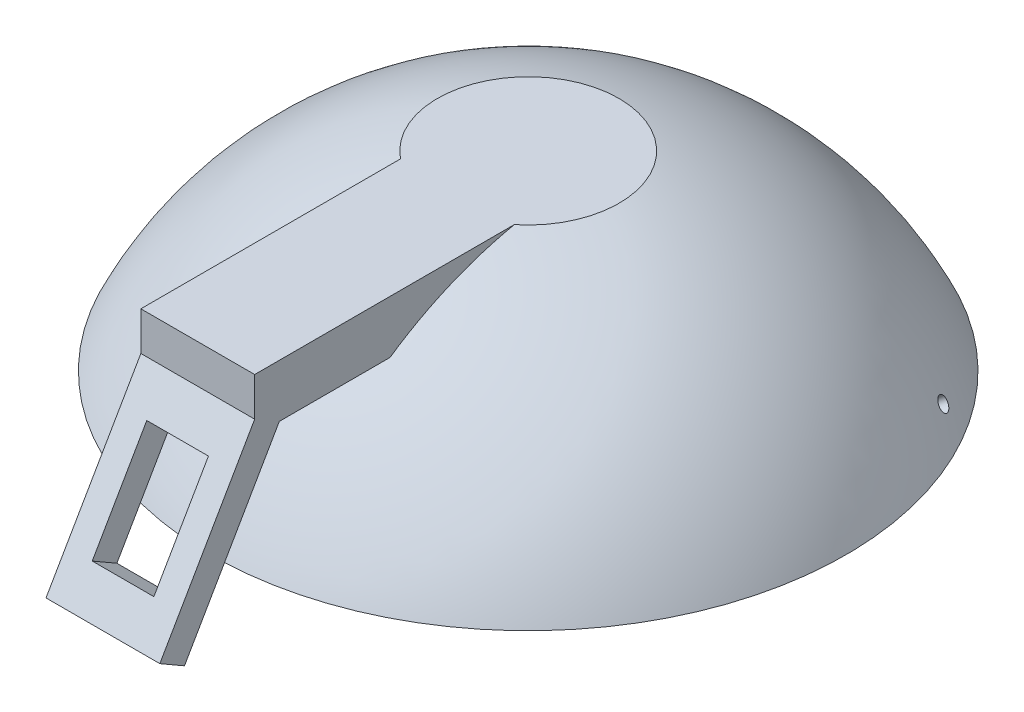
ISO-10303-21;
HEADER;
FILE_DESCRIPTION(('STEP AP214'),'2;1');
FILE_NAME('part.step','',(''),(''),'','','');
FILE_SCHEMA(('AUTOMOTIVE_DESIGN { 1 0 10303 214 1 1 1 1 }'));
ENDSEC;
DATA;
#1=APPLICATION_CONTEXT('core data for automotive mechanical design processes');
#2=APPLICATION_PROTOCOL_DEFINITION('international standard','automotive_design',2000,#1);
#3=PRODUCT_CONTEXT('',#1,'mechanical');
#4=PRODUCT('Part','Part','',(#3));
#5=PRODUCT_RELATED_PRODUCT_CATEGORY('part','',(#4));
#6=PRODUCT_DEFINITION_FORMATION('','',#4);
#7=PRODUCT_DEFINITION_CONTEXT('part definition',#1,'design');
#8=PRODUCT_DEFINITION('design','',#6,#7);
#9=PRODUCT_DEFINITION_SHAPE('','',#8);
#10=(LENGTH_UNIT() NAMED_UNIT(*) SI_UNIT(.MILLI.,.METRE.));
#11=(NAMED_UNIT(*) PLANE_ANGLE_UNIT() SI_UNIT($,.RADIAN.));
#12=(NAMED_UNIT(*) SI_UNIT($,.STERADIAN.) SOLID_ANGLE_UNIT());
#13=UNCERTAINTY_MEASURE_WITH_UNIT(LENGTH_MEASURE(1.E-05),#10,'distance_accuracy_value','');
#14=(GEOMETRIC_REPRESENTATION_CONTEXT(3) GLOBAL_UNCERTAINTY_ASSIGNED_CONTEXT((#13)) GLOBAL_UNIT_ASSIGNED_CONTEXT((#10,
#11,#12)) REPRESENTATION_CONTEXT('',''));
#15=CARTESIAN_POINT('',(0.,0.,0.));
#16=DIRECTION('',(0.,0.,1.));
#17=DIRECTION('',(1.,0.,0.));
#18=AXIS2_PLACEMENT_3D('',#15,#16,#17);
#19=CARTESIAN_POINT('',(0.,0.,0.));
#20=DIRECTION('',(0.,-1.,0.));
#21=DIRECTION('',(1.,0.,0.));
#22=AXIS2_PLACEMENT_3D('',#19,#20,#21);
#23=SPHERICAL_SURFACE('',#22,74.);
#24=CARTESIAN_POINT('',(55.4885968015053,36.9923978676701,-32.036356300303));
#25=DIRECTION('',(-0.750000000000003,-0.500000000000001,0.433012701892212));
#26=DIRECTION('',(0.554700196225228,-0.832050294337844,0.));
#27=AXIS2_PLACEMENT_3D('',#24,#25,#26);
#28=CIRCLE('',#27,1.5);
#29=CARTESIAN_POINT('',(56.3206470958432,35.7443224261634,-32.036356300303));
#30=VERTEX_POINT('',#29);
#31=EDGE_CURVE('E203',#30,#30,#28,.T.);
#32=ORIENTED_EDGE('',*,*,#31,.T.);
#33=EDGE_LOOP('',(#32));
#34=FACE_BOUND('',#33,.T.);
#35=CARTESIAN_POINT('',(0.,31.2737513688116,0.));
#36=DIRECTION('',(0.,-1.,0.));
#37=DIRECTION('',(0.,0.,-1.));
#38=AXIS2_PLACEMENT_3D('',#35,#36,#37);
#39=CIRCLE('',#38,67.0667762407122);
#40=CARTESIAN_POINT('',(0.,31.2737513688116,-67.0667762407122));
#41=VERTEX_POINT('',#40);
#42=EDGE_CURVE('E48',#41,#41,#39,.T.);
#43=ORIENTED_EDGE('',*,*,#42,.F.);
#44=EDGE_LOOP('',(#43));
#45=FACE_BOUND('',#44,.T.);
#46=CARTESIAN_POINT('',(0.,36.9923978676701,64.0727126006071));
#47=DIRECTION('',(0.,-0.500000000000001,-0.866025403784438));
#48=DIRECTION('',(0.,0.866025403784438,-0.500000000000001));
#49=AXIS2_PLACEMENT_3D('',#46,#47,#48);
#50=CIRCLE('',#49,1.5);
#51=CARTESIAN_POINT('',(0.,38.2914359733468,63.3227126006071));
#52=VERTEX_POINT('',#51);
#53=EDGE_CURVE('E222',#52,#52,#50,.T.);
#54=ORIENTED_EDGE('',*,*,#53,.T.);
#55=EDGE_LOOP('',(#54));
#56=FACE_BOUND('',#55,.T.);
#57=CARTESIAN_POINT('',(-55.4885968015049,36.9923978676701,-32.0363563003038));
#58=DIRECTION('',(0.749999999999998,-0.500000000000001,0.433012701892223));
#59=DIRECTION('',(0.554700196225231,0.832050294337842,0.));
#60=AXIS2_PLACEMENT_3D('',#57,#58,#59);
#61=CIRCLE('',#60,1.5);
#62=CARTESIAN_POINT('',(-54.656546507167,38.2404733091769,-32.0363563003038));
#63=VERTEX_POINT('',#62);
#64=EDGE_CURVE('E43',#63,#63,#61,.T.);
#65=ORIENTED_EDGE('',*,*,#64,.T.);
#66=EDGE_LOOP('',(#65));
#67=FACE_BOUND('',#66,.T.);
#68=CARTESIAN_POINT('',(0.,71.478511145391,0.));
#69=DIRECTION('',(0.,-1.,0.));
#70=DIRECTION('',(0.,0.,-1.));
#71=AXIS2_PLACEMENT_3D('',#68,#69,#70);
#72=CIRCLE('',#71,19.1526093375866);
#73=CARTESIAN_POINT('',(-12.,71.478511145391,14.9272383392981));
#74=VERTEX_POINT('',#73);
#75=CARTESIAN_POINT('',(12.,71.478511145391,14.927238339298));
#76=VERTEX_POINT('',#75);
#77=EDGE_CURVE('E129',#74,#76,#72,.T.);
#78=ORIENTED_EDGE('',*,*,#77,.T.);
#79=CARTESIAN_POINT('',(12.,0.,0.));
#80=DIRECTION('',(-1.,0.,0.));
#81=DIRECTION('',(0.,0.,1.));
#82=AXIS2_PLACEMENT_3D('',#79,#80,#81);
#83=CIRCLE('',#82,73.0205450541147);
#84=CARTESIAN_POINT('',(12.,60.3205080756888,41.151382789534));
#85=VERTEX_POINT('',#84);
#86=EDGE_CURVE('E56',#85,#76,#83,.T.);
#87=ORIENTED_EDGE('',*,*,#86,.F.);
#88=CARTESIAN_POINT('',(0.,60.3205080756888,0.));
#89=DIRECTION('',(0.,1.,0.));
#90=DIRECTION('',(0.,0.,1.));
#91=AXIS2_PLACEMENT_3D('',#88,#89,#90);
#92=CIRCLE('',#91,42.865327544424);
#93=CARTESIAN_POINT('',(-12.,60.3205080756888,41.151382789534));
#94=VERTEX_POINT('',#93);
#95=EDGE_CURVE('E60',#94,#85,#92,.T.);
#96=ORIENTED_EDGE('',*,*,#95,.F.);
#97=CARTESIAN_POINT('',(-12.,0.,0.));
#98=DIRECTION('',(1.,0.,0.));
#99=DIRECTION('',(0.,0.,-1.));
#100=AXIS2_PLACEMENT_3D('',#97,#98,#99);
#101=CIRCLE('',#100,73.0205450541147);
#102=EDGE_CURVE('E208',#74,#94,#101,.T.);
#103=ORIENTED_EDGE('',*,*,#102,.F.);
#104=EDGE_LOOP('',(#78,#87,#96,#103));
#105=FACE_BOUND('',#104,.T.);
#106=ADVANCED_FACE('F39',(#34,#45,#56,#67,#105),#23,.T.);
#107=CARTESIAN_POINT('',(0.,0.,0.));
#108=DIRECTION('',(0.,-1.,0.));
#109=DIRECTION('',(1.,0.,0.));
#110=AXIS2_PLACEMENT_3D('',#107,#108,#109);
#111=SPHERICAL_SURFACE('',#110,70.);
#112=CARTESIAN_POINT('',(52.4879450445531,34.9919633630353,-30.3039292006824));
#113=DIRECTION('',(-0.750000000000003,-0.500000000000001,0.433012701892212));
#114=DIRECTION('',(0.554700196225228,-0.832050294337844,0.));
#115=AXIS2_PLACEMENT_3D('',#112,#113,#114);
#116=CIRCLE('',#115,1.5);
#117=CARTESIAN_POINT('',(53.3199953388909,33.7438879215285,-30.3039292006824));
#118=VERTEX_POINT('',#117);
#119=EDGE_CURVE('E216',#118,#118,#116,.F.);
#120=ORIENTED_EDGE('',*,*,#119,.T.);
#121=EDGE_LOOP('',(#120));
#122=FACE_BOUND('',#121,.T.);
#123=CARTESIAN_POINT('',(0.,67.478511145391,0.));
#124=DIRECTION('',(0.,-1.,0.));
#125=DIRECTION('',(0.,0.,-1.));
#126=AXIS2_PLACEMENT_3D('',#123,#124,#125);
#127=CIRCLE('',#126,18.618553477683);
#128=CARTESIAN_POINT('',(0.,67.478511145391,-18.618553477683));
#129=VERTEX_POINT('',#128);
#130=EDGE_CURVE('E226',#129,#129,#127,.T.);
#131=ORIENTED_EDGE('',*,*,#130,.F.);
#132=EDGE_LOOP('',(#131));
#133=FACE_BOUND('',#132,.T.);
#134=CARTESIAN_POINT('',(0.,29.5832783218488,0.));
#135=DIRECTION('',(0.,-1.,0.));
#136=DIRECTION('',(0.,0.,-1.));
#137=AXIS2_PLACEMENT_3D('',#134,#135,#136);
#138=CIRCLE('',#137,63.4415450925656);
#139=CARTESIAN_POINT('',(0.,29.5832783218488,-63.4415450925656));
#140=VERTEX_POINT('',#139);
#141=EDGE_CURVE('E11',#140,#140,#138,.T.);
#142=ORIENTED_EDGE('',*,*,#141,.T.);
#143=EDGE_LOOP('',(#142));
#144=FACE_BOUND('',#143,.T.);
#145=CARTESIAN_POINT('',(0.,34.9919633630353,60.6078584013657));
#146=DIRECTION('',(0.,-0.500000000000001,-0.866025403784438));
#147=DIRECTION('',(0.,0.866025403784438,-0.500000000000001));
#148=AXIS2_PLACEMENT_3D('',#145,#146,#147);
#149=CIRCLE('',#148,1.5);
#150=CARTESIAN_POINT('',(0.,36.291001468712,59.8578584013657));
#151=VERTEX_POINT('',#150);
#152=EDGE_CURVE('E223',#151,#151,#149,.F.);
#153=ORIENTED_EDGE('',*,*,#152,.T.);
#154=EDGE_LOOP('',(#153));
#155=FACE_BOUND('',#154,.T.);
#156=CARTESIAN_POINT('',(-52.4879450445527,34.9919633630353,-30.3039292006831));
#157=DIRECTION('',(0.749999999999998,-0.500000000000001,0.433012701892223));
#158=DIRECTION('',(0.554700196225231,0.832050294337842,0.));
#159=AXIS2_PLACEMENT_3D('',#156,#157,#158);
#160=CIRCLE('',#159,1.5);
#161=CARTESIAN_POINT('',(-51.6558947502148,36.2400388045421,-30.3039292006831));
#162=VERTEX_POINT('',#161);
#163=EDGE_CURVE('E219',#162,#162,#160,.F.);
#164=ORIENTED_EDGE('',*,*,#163,.T.);
#165=EDGE_LOOP('',(#164));
#166=FACE_BOUND('',#165,.T.);
#167=ADVANCED_FACE('F41',(#122,#133,#144,#155,#166),#111,.F.);
#168=CARTESIAN_POINT('',(0.,29.5832783218488,0.));
#169=DIRECTION('',(0.,1.,0.));
#170=DIRECTION('',(0.,0.,1.));
#171=AXIS2_PLACEMENT_3D('',#168,#169,#170);
#172=CONICAL_SURFACE('',#171,63.4415450925656,1.13446401379632);
#173=ORIENTED_EDGE('',*,*,#42,.T.);
#174=EDGE_LOOP('',(#173));
#175=FACE_BOUND('',#174,.T.);
#176=ORIENTED_EDGE('',*,*,#141,.F.);
#177=EDGE_LOOP('',(#176));
#178=FACE_BOUND('',#177,.T.);
#179=ADVANCED_FACE('F261',(#175,#178),#172,.T.);
#180=CARTESIAN_POINT('',(19.1526093375866,71.478511145391,0.));
#181=DIRECTION('',(0.,1.,0.));
#182=DIRECTION('',(0.,0.,1.));
#183=AXIS2_PLACEMENT_3D('',#180,#181,#182);
#184=PLANE('',#183);
#185=ORIENTED_EDGE('',*,*,#77,.F.);
#186=DIRECTION('',(0.,0.,1.));
#187=VECTOR('',#186,1.);
#188=CARTESIAN_POINT('',(-12.,71.478511145391,-67.0687762407122));
#189=LINE('',#188,#187);
#190=CARTESIAN_POINT('',(-12.,71.478511145391,69.6743371481683));
#191=VERTEX_POINT('',#190);
#192=EDGE_CURVE('E123',#74,#191,#189,.T.);
#193=ORIENTED_EDGE('',*,*,#192,.T.);
#194=DIRECTION('',(1.,0.,0.));
#195=VECTOR('',#194,1.);
#196=CARTESIAN_POINT('',(-12.,71.478511145391,69.6743371481683));
#197=LINE('',#196,#195);
#198=CARTESIAN_POINT('',(12.,71.478511145391,69.6743371481683));
#199=VERTEX_POINT('',#198);
#200=EDGE_CURVE('E128',#191,#199,#197,.T.);
#201=ORIENTED_EDGE('',*,*,#200,.T.);
#202=DIRECTION('',(0.,0.,1.));
#203=VECTOR('',#202,1.);
#204=CARTESIAN_POINT('',(12.,71.478511145391,-67.0687762407122));
#205=LINE('',#204,#203);
#206=EDGE_CURVE('E205',#76,#199,#205,.T.);
#207=ORIENTED_EDGE('',*,*,#206,.F.);
#208=EDGE_LOOP('',(#185,#193,#201,#207));
#209=FACE_BOUND('',#208,.T.);
#210=ADVANCED_FACE('F125',(#209),#184,.T.);
#211=CARTESIAN_POINT('',(0.,67.478511145391,0.));
#212=DIRECTION('',(0.,-1.,0.));
#213=DIRECTION('',(0.,0.,-1.));
#214=AXIS2_PLACEMENT_3D('',#211,#212,#213);
#215=PLANE('',#214);
#216=ORIENTED_EDGE('',*,*,#130,.T.);
#217=EDGE_LOOP('',(#216));
#218=FACE_BOUND('',#217,.T.);
#219=ADVANCED_FACE('F251',(#218),#215,.T.);
#220=CARTESIAN_POINT('',(0.,46.9103937735395,81.251185418833));
#221=DIRECTION('',(0.,-0.500000000000001,-0.866025403784438));
#222=DIRECTION('',(0.,0.866025403784438,-0.500000000000001));
#223=AXIS2_PLACEMENT_3D('',#220,#221,#222);
#224=CYLINDRICAL_SURFACE('',#223,1.5);
#225=ORIENTED_EDGE('',*,*,#152,.F.);
#226=EDGE_LOOP('',(#225));
#227=FACE_BOUND('',#226,.T.);
#228=ORIENTED_EDGE('',*,*,#53,.F.);
#229=EDGE_LOOP('',(#228));
#230=FACE_BOUND('',#229,.T.);
#231=ADVANCED_FACE('F241',(#227,#230),#224,.F.);
#232=CARTESIAN_POINT('',(86.3100778053162,57.5400518702107,-49.8311466546758));
#233=DIRECTION('',(-0.750000000000003,-0.500000000000001,0.433012701892212));
#234=DIRECTION('',(0.554700196225228,-0.832050294337844,0.));
#235=AXIS2_PLACEMENT_3D('',#232,#233,#234);
#236=CYLINDRICAL_SURFACE('',#235,1.5);
#237=ORIENTED_EDGE('',*,*,#119,.F.);
#238=EDGE_LOOP('',(#237));
#239=FACE_BOUND('',#238,.T.);
#240=ORIENTED_EDGE('',*,*,#31,.F.);
#241=EDGE_LOOP('',(#240));
#242=FACE_BOUND('',#241,.T.);
#243=ADVANCED_FACE('F238',(#239,#242),#236,.F.);
#244=CARTESIAN_POINT('',(-86.3100778053158,57.5400518702109,-49.8311466546772));
#245=DIRECTION('',(0.749999999999998,-0.500000000000001,0.433012701892223));
#246=DIRECTION('',(0.554700196225231,0.832050294337842,0.));
#247=AXIS2_PLACEMENT_3D('',#244,#245,#246);
#248=CYLINDRICAL_SURFACE('',#247,1.5);
#249=ORIENTED_EDGE('',*,*,#163,.F.);
#250=EDGE_LOOP('',(#249));
#251=FACE_BOUND('',#250,.T.);
#252=ORIENTED_EDGE('',*,*,#64,.F.);
#253=EDGE_LOOP('',(#252));
#254=FACE_BOUND('',#253,.T.);
#255=ADVANCED_FACE('F240',(#251,#254),#248,.F.);
#256=CARTESIAN_POINT('',(12.,71.478511145391,-67.0687762407122));
#257=DIRECTION('',(-1.,0.,0.));
#258=DIRECTION('',(0.,0.,1.));
#259=AXIS2_PLACEMENT_3D('',#256,#257,#258);
#260=PLANE('',#259);
#261=DIRECTION('',(0.,0.,1.));
#262=VECTOR('',#261,1.);
#263=CARTESIAN_POINT('',(12.,60.3205080756888,-67.0687762407122));
#264=LINE('',#263,#262);
#265=CARTESIAN_POINT('',(12.,60.3205080756888,64.4781847254616));
#266=VERTEX_POINT('',#265);
#267=EDGE_CURVE('E207',#85,#266,#264,.T.);
#268=ORIENTED_EDGE('',*,*,#267,.F.);
#269=ORIENTED_EDGE('',*,*,#86,.T.);
#270=ORIENTED_EDGE('',*,*,#206,.T.);
#271=DIRECTION('',(0.,1.,0.));
#272=VECTOR('',#271,1.);
#273=CARTESIAN_POINT('',(12.,25.6774919243113,69.6743371481683));
#274=LINE('',#273,#272);
#275=CARTESIAN_POINT('',(12.,63.3205080756888,69.6743371481683));
#276=VERTEX_POINT('',#275);
#277=EDGE_CURVE('E144',#276,#199,#274,.T.);
#278=ORIENTED_EDGE('',*,*,#277,.F.);
#279=DIRECTION('',(0.,0.866025403784438,-0.500000000000001));
#280=VECTOR('',#279,1.);
#281=CARTESIAN_POINT('',(12.,63.3205080756888,69.6743371481683));
#282=LINE('',#281,#280);
#283=CARTESIAN_POINT('',(12.,28.6794919243113,89.6743371481683));
#284=VERTEX_POINT('',#283);
#285=EDGE_CURVE('E187',#284,#276,#282,.T.);
#286=ORIENTED_EDGE('',*,*,#285,.F.);
#287=DIRECTION('',(0.,-0.500000000000001,-0.866025403784438));
#288=VECTOR('',#287,1.);
#289=CARTESIAN_POINT('',(12.,28.6794919243113,89.6743371481683));
#290=LINE('',#289,#288);
#291=CARTESIAN_POINT('',(12.,25.6794919243113,84.4781847254617));
#292=VERTEX_POINT('',#291);
#293=EDGE_CURVE('E191',#284,#292,#290,.T.);
#294=ORIENTED_EDGE('',*,*,#293,.T.);
#295=DIRECTION('',(0.,0.866025403784438,-0.500000000000001));
#296=VECTOR('',#295,1.);
#297=CARTESIAN_POINT('',(12.,60.3205080756888,64.4781847254616));
#298=LINE('',#297,#296);
#299=EDGE_CURVE('E185',#292,#266,#298,.T.);
#300=ORIENTED_EDGE('',*,*,#299,.T.);
#301=EDGE_LOOP('',(#268,#269,#270,#278,#286,#294,#300));
#302=FACE_BOUND('',#301,.T.);
#303=ADVANCED_FACE('F248',(#302),#260,.F.);
#304=CARTESIAN_POINT('',(12.,60.3205080756888,-67.0687762407122));
#305=DIRECTION('',(0.,1.,0.));
#306=DIRECTION('',(0.,0.,1.));
#307=AXIS2_PLACEMENT_3D('',#304,#305,#306);
#308=PLANE('',#307);
#309=DIRECTION('',(0.,0.,1.));
#310=VECTOR('',#309,1.);
#311=CARTESIAN_POINT('',(-12.,60.3205080756888,-67.0687762407122));
#312=LINE('',#311,#310);
#313=CARTESIAN_POINT('',(-12.,60.3205080756888,64.4781847254616));
#314=VERTEX_POINT('',#313);
#315=EDGE_CURVE('E132',#94,#314,#312,.T.);
#316=ORIENTED_EDGE('',*,*,#315,.F.);
#317=ORIENTED_EDGE('',*,*,#95,.T.);
#318=ORIENTED_EDGE('',*,*,#267,.T.);
#319=DIRECTION('',(-1.,0.,0.));
#320=VECTOR('',#319,1.);
#321=CARTESIAN_POINT('',(12.,60.3205080756888,64.4781847254616));
#322=LINE('',#321,#320);
#323=EDGE_CURVE('E131',#266,#314,#322,.T.);
#324=ORIENTED_EDGE('',*,*,#323,.T.);
#325=EDGE_LOOP('',(#316,#317,#318,#324));
#326=FACE_BOUND('',#325,.T.);
#327=ADVANCED_FACE('F288',(#326),#308,.F.);
#328=CARTESIAN_POINT('',(-12.,60.3205080756888,-67.0687762407122));
#329=DIRECTION('',(1.,0.,0.));
#330=DIRECTION('',(0.,0.,-1.));
#331=AXIS2_PLACEMENT_3D('',#328,#329,#330);
#332=PLANE('',#331);
#333=ORIENTED_EDGE('',*,*,#192,.F.);
#334=ORIENTED_EDGE('',*,*,#102,.T.);
#335=ORIENTED_EDGE('',*,*,#315,.T.);
#336=DIRECTION('',(0.,-0.866025403784438,0.500000000000001));
#337=VECTOR('',#336,1.);
#338=CARTESIAN_POINT('',(-12.,60.3205080756888,64.4781847254616));
#339=LINE('',#338,#337);
#340=CARTESIAN_POINT('',(-12.,25.6794919243113,84.4781847254617));
#341=VERTEX_POINT('',#340);
#342=EDGE_CURVE('E182',#314,#341,#339,.T.);
#343=ORIENTED_EDGE('',*,*,#342,.T.);
#344=DIRECTION('',(0.,-0.500000000000001,-0.866025403784438));
#345=VECTOR('',#344,1.);
#346=CARTESIAN_POINT('',(-12.,28.6794919243113,89.6743371481683));
#347=LINE('',#346,#345);
#348=CARTESIAN_POINT('',(-12.,28.6794919243113,89.6743371481683));
#349=VERTEX_POINT('',#348);
#350=EDGE_CURVE('E199',#349,#341,#347,.T.);
#351=ORIENTED_EDGE('',*,*,#350,.F.);
#352=DIRECTION('',(0.,-0.866025403784438,0.500000000000001));
#353=VECTOR('',#352,1.);
#354=CARTESIAN_POINT('',(-12.,63.3205080756888,69.6743371481683));
#355=LINE('',#354,#353);
#356=CARTESIAN_POINT('',(-12.,63.3205080756888,69.6743371481683));
#357=VERTEX_POINT('',#356);
#358=EDGE_CURVE('E140',#357,#349,#355,.T.);
#359=ORIENTED_EDGE('',*,*,#358,.F.);
#360=DIRECTION('',(0.,1.,0.));
#361=VECTOR('',#360,1.);
#362=CARTESIAN_POINT('',(-12.,25.6774919243113,69.6743371481683));
#363=LINE('',#362,#361);
#364=EDGE_CURVE('E136',#357,#191,#363,.T.);
#365=ORIENTED_EDGE('',*,*,#364,.T.);
#366=EDGE_LOOP('',(#333,#334,#335,#343,#351,#359,#365));
#367=FACE_BOUND('',#366,.T.);
#368=ADVANCED_FACE('F137',(#367),#332,.F.);
#369=CARTESIAN_POINT('',(0.,46.0000000000001,79.6743371481683));
#370=DIRECTION('',(0.,-0.500000000000001,-0.866025403784438));
#371=DIRECTION('',(0.,0.866025403784438,-0.500000000000001));
#372=AXIS2_PLACEMENT_3D('',#369,#370,#371);
#373=PLANE('',#372);
#374=ORIENTED_EDGE('',*,*,#358,.T.);
#375=DIRECTION('',(1.,0.,0.));
#376=VECTOR('',#375,1.);
#377=CARTESIAN_POINT('',(12.,28.6794919243113,89.6743371481683));
#378=LINE('',#377,#376);
#379=EDGE_CURVE('E184',#349,#284,#378,.T.);
#380=ORIENTED_EDGE('',*,*,#379,.T.);
#381=ORIENTED_EDGE('',*,*,#285,.T.);
#382=DIRECTION('',(-1.,0.,0.));
#383=VECTOR('',#382,1.);
#384=CARTESIAN_POINT('',(12.,63.3205080756888,69.6743371481683));
#385=LINE('',#384,#383);
#386=EDGE_CURVE('E189',#276,#357,#385,.T.);
#387=ORIENTED_EDGE('',*,*,#386,.T.);
#388=EDGE_LOOP('',(#374,#380,#381,#387));
#389=FACE_BOUND('',#388,.T.);
#390=DIRECTION('',(0.,-0.866025403784438,0.500000000000001));
#391=VECTOR('',#390,1.);
#392=CARTESIAN_POINT('',(-6.5,55.9592921435211,73.9243371481683));
#393=LINE('',#392,#391);
#394=CARTESIAN_POINT('',(-6.5,55.9592921435211,73.9243371481683));
#395=VERTEX_POINT('',#394);
#396=CARTESIAN_POINT('',(-6.5,36.040707856479,85.4243371481683));
#397=VERTEX_POINT('',#396);
#398=EDGE_CURVE('E152',#395,#397,#393,.T.);
#399=ORIENTED_EDGE('',*,*,#398,.F.);
#400=DIRECTION('',(-1.,0.,0.));
#401=VECTOR('',#400,1.);
#402=CARTESIAN_POINT('',(6.5,55.9592921435211,73.9243371481683));
#403=LINE('',#402,#401);
#404=CARTESIAN_POINT('',(6.5,55.9592921435211,73.9243371481683));
#405=VERTEX_POINT('',#404);
#406=EDGE_CURVE('E160',#405,#395,#403,.T.);
#407=ORIENTED_EDGE('',*,*,#406,.F.);
#408=DIRECTION('',(0.,0.866025403784438,-0.500000000000001));
#409=VECTOR('',#408,1.);
#410=CARTESIAN_POINT('',(6.5,55.9592921435211,73.9243371481683));
#411=LINE('',#410,#409);
#412=CARTESIAN_POINT('',(6.5,36.040707856479,85.4243371481683));
#413=VERTEX_POINT('',#412);
#414=EDGE_CURVE('E157',#413,#405,#411,.T.);
#415=ORIENTED_EDGE('',*,*,#414,.F.);
#416=DIRECTION('',(1.,0.,0.));
#417=VECTOR('',#416,1.);
#418=CARTESIAN_POINT('',(6.5,36.040707856479,85.4243371481683));
#419=LINE('',#418,#417);
#420=EDGE_CURVE('E154',#397,#413,#419,.T.);
#421=ORIENTED_EDGE('',*,*,#420,.F.);
#422=EDGE_LOOP('',(#399,#407,#415,#421));
#423=FACE_BOUND('',#422,.T.);
#424=ADVANCED_FACE('F297',(#389,#423),#373,.F.);
#425=CARTESIAN_POINT('',(0.,43.0000000000001,74.4781847254617));
#426=DIRECTION('',(0.,-0.500000000000001,-0.866025403784438));
#427=DIRECTION('',(0.,0.866025403784438,-0.500000000000001));
#428=AXIS2_PLACEMENT_3D('',#425,#426,#427);
#429=PLANE('',#428);
#430=ORIENTED_EDGE('',*,*,#342,.F.);
#431=ORIENTED_EDGE('',*,*,#323,.F.);
#432=ORIENTED_EDGE('',*,*,#299,.F.);
#433=DIRECTION('',(1.,0.,0.));
#434=VECTOR('',#433,1.);
#435=CARTESIAN_POINT('',(12.,25.6794919243113,84.4781847254617));
#436=LINE('',#435,#434);
#437=EDGE_CURVE('E194',#341,#292,#436,.T.);
#438=ORIENTED_EDGE('',*,*,#437,.F.);
#439=EDGE_LOOP('',(#430,#431,#432,#438));
#440=FACE_BOUND('',#439,.T.);
#441=DIRECTION('',(-1.,0.,0.));
#442=VECTOR('',#441,1.);
#443=CARTESIAN_POINT('',(6.5,52.9592921435211,68.7281847254616));
#444=LINE('',#443,#442);
#445=CARTESIAN_POINT('',(6.5,52.9592921435211,68.7281847254616));
#446=VERTEX_POINT('',#445);
#447=CARTESIAN_POINT('',(-6.5,52.9592921435211,68.7281847254617));
#448=VERTEX_POINT('',#447);
#449=EDGE_CURVE('E155',#446,#448,#444,.T.);
#450=ORIENTED_EDGE('',*,*,#449,.T.);
#451=DIRECTION('',(0.,-0.866025403784438,0.500000000000001));
#452=VECTOR('',#451,1.);
#453=CARTESIAN_POINT('',(-6.5,52.9592921435211,68.7281847254616));
#454=LINE('',#453,#452);
#455=CARTESIAN_POINT('',(-6.5,33.040707856479,80.2281847254617));
#456=VERTEX_POINT('',#455);
#457=EDGE_CURVE('E143',#448,#456,#454,.T.);
#458=ORIENTED_EDGE('',*,*,#457,.T.);
#459=DIRECTION('',(1.,0.,0.));
#460=VECTOR('',#459,1.);
#461=CARTESIAN_POINT('',(6.5,33.040707856479,80.2281847254617));
#462=LINE('',#461,#460);
#463=CARTESIAN_POINT('',(6.5,33.040707856479,80.2281847254617));
#464=VERTEX_POINT('',#463);
#465=EDGE_CURVE('E165',#456,#464,#462,.T.);
#466=ORIENTED_EDGE('',*,*,#465,.T.);
#467=DIRECTION('',(0.,0.866025403784438,-0.500000000000001));
#468=VECTOR('',#467,1.);
#469=CARTESIAN_POINT('',(6.5,52.9592921435211,68.7281847254616));
#470=LINE('',#469,#468);
#471=EDGE_CURVE('E168',#464,#446,#470,.T.);
#472=ORIENTED_EDGE('',*,*,#471,.T.);
#473=EDGE_LOOP('',(#450,#458,#466,#472));
#474=FACE_BOUND('',#473,.T.);
#475=ADVANCED_FACE('F290',(#440,#474),#429,.T.);
#476=CARTESIAN_POINT('',(12.,28.6794919243113,89.6743371481683));
#477=DIRECTION('',(0.,0.866025403784438,-0.500000000000001));
#478=DIRECTION('',(0.,0.500000000000001,0.866025403784438));
#479=AXIS2_PLACEMENT_3D('',#476,#477,#478);
#480=PLANE('',#479);
#481=ORIENTED_EDGE('',*,*,#437,.T.);
#482=ORIENTED_EDGE('',*,*,#293,.F.);
#483=ORIENTED_EDGE('',*,*,#379,.F.);
#484=ORIENTED_EDGE('',*,*,#350,.T.);
#485=EDGE_LOOP('',(#481,#482,#483,#484));
#486=FACE_BOUND('',#485,.T.);
#487=ADVANCED_FACE('F294',(#486),#480,.F.);
#488=CARTESIAN_POINT('',(-6.5,55.9592921435211,73.9243371481683));
#489=DIRECTION('',(1.,0.,0.));
#490=DIRECTION('',(0.,0.,-1.));
#491=AXIS2_PLACEMENT_3D('',#488,#489,#490);
#492=PLANE('',#491);
#493=ORIENTED_EDGE('',*,*,#457,.F.);
#494=DIRECTION('',(0.,-0.500000000000001,-0.866025403784438));
#495=VECTOR('',#494,1.);
#496=CARTESIAN_POINT('',(-6.5,55.9592921435211,73.9243371481683));
#497=LINE('',#496,#495);
#498=EDGE_CURVE('E162',#395,#448,#497,.T.);
#499=ORIENTED_EDGE('',*,*,#498,.F.);
#500=ORIENTED_EDGE('',*,*,#398,.T.);
#501=DIRECTION('',(0.,-0.500000000000001,-0.866025403784438));
#502=VECTOR('',#501,1.);
#503=CARTESIAN_POINT('',(-6.5,36.040707856479,85.4243371481683));
#504=LINE('',#503,#502);
#505=EDGE_CURVE('E179',#397,#456,#504,.T.);
#506=ORIENTED_EDGE('',*,*,#505,.T.);
#507=EDGE_LOOP('',(#493,#499,#500,#506));
#508=FACE_BOUND('',#507,.T.);
#509=ADVANCED_FACE('F308',(#508),#492,.T.);
#510=CARTESIAN_POINT('',(6.5,36.040707856479,85.4243371481683));
#511=DIRECTION('',(0.,0.866025403784438,-0.500000000000001));
#512=DIRECTION('',(0.,0.500000000000001,0.866025403784438));
#513=AXIS2_PLACEMENT_3D('',#510,#511,#512);
#514=PLANE('',#513);
#515=ORIENTED_EDGE('',*,*,#465,.F.);
#516=ORIENTED_EDGE('',*,*,#505,.F.);
#517=ORIENTED_EDGE('',*,*,#420,.T.);
#518=DIRECTION('',(0.,-0.500000000000001,-0.866025403784438));
#519=VECTOR('',#518,1.);
#520=CARTESIAN_POINT('',(6.5,36.040707856479,85.4243371481683));
#521=LINE('',#520,#519);
#522=EDGE_CURVE('E177',#413,#464,#521,.T.);
#523=ORIENTED_EDGE('',*,*,#522,.T.);
#524=EDGE_LOOP('',(#515,#516,#517,#523));
#525=FACE_BOUND('',#524,.T.);
#526=ADVANCED_FACE('F310',(#525),#514,.T.);
#527=CARTESIAN_POINT('',(6.5,55.9592921435211,73.9243371481683));
#528=DIRECTION('',(-1.,0.,0.));
#529=DIRECTION('',(0.,0.,1.));
#530=AXIS2_PLACEMENT_3D('',#527,#528,#529);
#531=PLANE('',#530);
#532=ORIENTED_EDGE('',*,*,#471,.F.);
#533=ORIENTED_EDGE('',*,*,#522,.F.);
#534=ORIENTED_EDGE('',*,*,#414,.T.);
#535=DIRECTION('',(0.,-0.500000000000001,-0.866025403784438));
#536=VECTOR('',#535,1.);
#537=CARTESIAN_POINT('',(6.5,55.9592921435211,73.9243371481683));
#538=LINE('',#537,#536);
#539=EDGE_CURVE('E175',#405,#446,#538,.T.);
#540=ORIENTED_EDGE('',*,*,#539,.T.);
#541=EDGE_LOOP('',(#532,#533,#534,#540));
#542=FACE_BOUND('',#541,.T.);
#543=ADVANCED_FACE('F317',(#542),#531,.T.);
#544=CARTESIAN_POINT('',(6.5,55.9592921435211,73.9243371481683));
#545=DIRECTION('',(0.,-0.866025403784438,0.500000000000001));
#546=DIRECTION('',(0.,-0.500000000000001,-0.866025403784438));
#547=AXIS2_PLACEMENT_3D('',#544,#545,#546);
#548=PLANE('',#547);
#549=ORIENTED_EDGE('',*,*,#449,.F.);
#550=ORIENTED_EDGE('',*,*,#539,.F.);
#551=ORIENTED_EDGE('',*,*,#406,.T.);
#552=ORIENTED_EDGE('',*,*,#498,.T.);
#553=EDGE_LOOP('',(#549,#550,#551,#552));
#554=FACE_BOUND('',#553,.T.);
#555=ADVANCED_FACE('F315',(#554),#548,.T.);
#556=CARTESIAN_POINT('',(-12.,25.6774919243113,69.6743371481683));
#557=DIRECTION('',(0.,0.,1.));
#558=DIRECTION('',(1.,0.,0.));
#559=AXIS2_PLACEMENT_3D('',#556,#557,#558);
#560=PLANE('',#559);
#561=ORIENTED_EDGE('',*,*,#364,.F.);
#562=ORIENTED_EDGE('',*,*,#386,.F.);
#563=ORIENTED_EDGE('',*,*,#277,.T.);
#564=ORIENTED_EDGE('',*,*,#200,.F.);
#565=EDGE_LOOP('',(#561,#562,#563,#564));
#566=FACE_BOUND('',#565,.T.);
#567=ADVANCED_FACE('F147',(#566),#560,.T.);
#568=CLOSED_SHELL('',(#106,#167,#179,#210,#219,#231,#243,#255,#303,#327,#368,#424,#475,#487,
#509,#526,#543,#555,#567));
#569=MANIFOLD_SOLID_BREP('B2',#568);
#570=ADVANCED_BREP_SHAPE_REPRESENTATION('',(#18,#569),#14);
#571=SHAPE_DEFINITION_REPRESENTATION(#9,#570);
ENDSEC;
END-ISO-10303-21;
